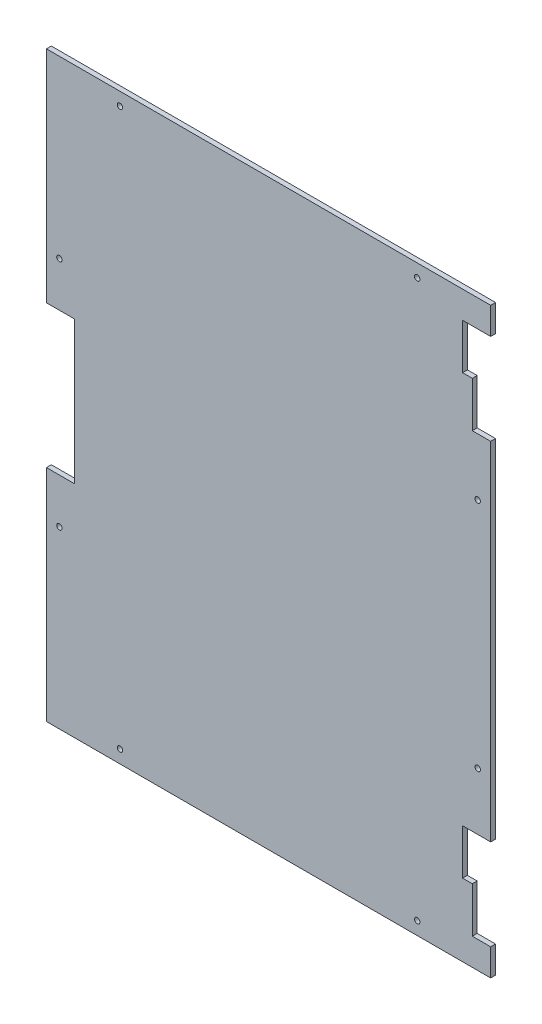
ISO-10303-21;
HEADER;
FILE_DESCRIPTION(('STEP AP214'),'2;1');
FILE_NAME('part.step','',(''),(''),'','','');
FILE_SCHEMA(('AUTOMOTIVE_DESIGN { 1 0 10303 214 1 1 1 1 }'));
ENDSEC;
DATA;
#1=APPLICATION_CONTEXT('core data for automotive mechanical design processes');
#2=APPLICATION_PROTOCOL_DEFINITION('international standard','automotive_design',2000,#1);
#3=PRODUCT_CONTEXT('',#1,'mechanical');
#4=PRODUCT('Part','Part','',(#3));
#5=PRODUCT_RELATED_PRODUCT_CATEGORY('part','',(#4));
#6=PRODUCT_DEFINITION_FORMATION('','',#4);
#7=PRODUCT_DEFINITION_CONTEXT('part definition',#1,'design');
#8=PRODUCT_DEFINITION('design','',#6,#7);
#9=PRODUCT_DEFINITION_SHAPE('','',#8);
#10=(LENGTH_UNIT() NAMED_UNIT(*) SI_UNIT(.MILLI.,.METRE.));
#11=(NAMED_UNIT(*) PLANE_ANGLE_UNIT() SI_UNIT($,.RADIAN.));
#12=(NAMED_UNIT(*) SI_UNIT($,.STERADIAN.) SOLID_ANGLE_UNIT());
#13=UNCERTAINTY_MEASURE_WITH_UNIT(LENGTH_MEASURE(1.E-05),#10,'distance_accuracy_value','');
#14=(GEOMETRIC_REPRESENTATION_CONTEXT(3) GLOBAL_UNCERTAINTY_ASSIGNED_CONTEXT((#13)) GLOBAL_UNIT_ASSIGNED_CONTEXT((#10,
#11,#12)) REPRESENTATION_CONTEXT('',''));
#15=CARTESIAN_POINT('',(0.,0.,0.));
#16=DIRECTION('',(0.,0.,1.));
#17=DIRECTION('',(1.,0.,0.));
#18=AXIS2_PLACEMENT_3D('',#15,#16,#17);
#19=CARTESIAN_POINT('',(0.,0.,4.5));
#20=DIRECTION('',(0.,0.,1.));
#21=DIRECTION('',(1.,0.,0.));
#22=AXIS2_PLACEMENT_3D('',#19,#20,#21);
#23=PLANE('',#22);
#24=CARTESIAN_POINT('',(192.5,107.5,4.5));
#25=DIRECTION('',(0.,0.,1.));
#26=DIRECTION('',(-1.,0.,0.));
#27=AXIS2_PLACEMENT_3D('',#24,#25,#26);
#28=CIRCLE('',#27,2.5);
#29=CARTESIAN_POINT('',(190.,107.5,4.5));
#30=VERTEX_POINT('',#29);
#31=EDGE_CURVE('E661',#30,#30,#28,.T.);
#32=ORIENTED_EDGE('',*,*,#31,.F.);
#33=EDGE_LOOP('',(#32));
#34=FACE_BOUND('',#33,.T.);
#35=CARTESIAN_POINT('',(-194.5,107.5,4.5));
#36=DIRECTION('',(0.,0.,1.));
#37=DIRECTION('',(1.,0.,0.));
#38=AXIS2_PLACEMENT_3D('',#35,#36,#37);
#39=CIRCLE('',#38,2.5);
#40=CARTESIAN_POINT('',(-192.,107.5,4.5));
#41=VERTEX_POINT('',#40);
#42=EDGE_CURVE('E673',#41,#41,#39,.T.);
#43=ORIENTED_EDGE('',*,*,#42,.F.);
#44=EDGE_LOOP('',(#43));
#45=FACE_BOUND('',#44,.T.);
#46=CARTESIAN_POINT('',(-138.5,257.5,4.5));
#47=DIRECTION('',(0.,0.,1.));
#48=DIRECTION('',(1.,0.,0.));
#49=AXIS2_PLACEMENT_3D('',#46,#47,#48);
#50=CIRCLE('',#49,2.5);
#51=CARTESIAN_POINT('',(-136.,257.5,4.5));
#52=VERTEX_POINT('',#51);
#53=EDGE_CURVE('E685',#52,#52,#50,.T.);
#54=ORIENTED_EDGE('',*,*,#53,.F.);
#55=EDGE_LOOP('',(#54));
#56=FACE_BOUND('',#55,.T.);
#57=CARTESIAN_POINT('',(136.5,-257.5,4.5));
#58=DIRECTION('',(0.,0.,1.));
#59=DIRECTION('',(1.,0.,0.));
#60=AXIS2_PLACEMENT_3D('',#57,#58,#59);
#61=CIRCLE('',#60,2.5);
#62=CARTESIAN_POINT('',(139.,-257.5,4.5));
#63=VERTEX_POINT('',#62);
#64=EDGE_CURVE('E208',#63,#63,#61,.T.);
#65=ORIENTED_EDGE('',*,*,#64,.F.);
#66=EDGE_LOOP('',(#65));
#67=FACE_BOUND('',#66,.T.);
#68=DIRECTION('',(0.,-1.,0.));
#69=VECTOR('',#68,1.);
#70=CARTESIAN_POINT('',(-206.5,269.5,4.5));
#71=LINE('',#70,#69);
#72=CARTESIAN_POINT('',(-206.5,269.5,4.5));
#73=VERTEX_POINT('',#72);
#74=CARTESIAN_POINT('',(-206.5,66.,4.5));
#75=VERTEX_POINT('',#74);
#76=EDGE_CURVE('E132',#73,#75,#71,.T.);
#77=ORIENTED_EDGE('',*,*,#76,.T.);
#78=DIRECTION('',(1.,0.,0.));
#79=VECTOR('',#78,1.);
#80=CARTESIAN_POINT('',(-206.5,66.,4.5));
#81=LINE('',#80,#79);
#82=CARTESIAN_POINT('',(-180.5,66.,4.5));
#83=VERTEX_POINT('',#82);
#84=EDGE_CURVE('E353',#75,#83,#81,.T.);
#85=ORIENTED_EDGE('',*,*,#84,.T.);
#86=DIRECTION('',(0.,-1.,0.));
#87=VECTOR('',#86,1.);
#88=CARTESIAN_POINT('',(-180.5,66.,4.5));
#89=LINE('',#88,#87);
#90=CARTESIAN_POINT('',(-180.5,-66.,4.5));
#91=VERTEX_POINT('',#90);
#92=EDGE_CURVE('E297',#83,#91,#89,.T.);
#93=ORIENTED_EDGE('',*,*,#92,.T.);
#94=DIRECTION('',(-1.,0.,0.));
#95=VECTOR('',#94,1.);
#96=CARTESIAN_POINT('',(-206.5,-66.,4.5));
#97=LINE('',#96,#95);
#98=CARTESIAN_POINT('',(-206.5,-66.,4.5));
#99=VERTEX_POINT('',#98);
#100=EDGE_CURVE('E315',#91,#99,#97,.T.);
#101=ORIENTED_EDGE('',*,*,#100,.T.);
#102=DIRECTION('',(0.,-1.,0.));
#103=VECTOR('',#102,1.);
#104=CARTESIAN_POINT('',(-206.5,-66.,4.5));
#105=LINE('',#104,#103);
#106=CARTESIAN_POINT('',(-206.5,-269.5,4.5));
#107=VERTEX_POINT('',#106);
#108=EDGE_CURVE('E312',#99,#107,#105,.T.);
#109=ORIENTED_EDGE('',*,*,#108,.T.);
#110=DIRECTION('',(1.,0.,0.));
#111=VECTOR('',#110,1.);
#112=CARTESIAN_POINT('',(-206.5,-269.5,4.5));
#113=LINE('',#112,#111);
#114=CARTESIAN_POINT('',(204.5,-269.5,4.5));
#115=VERTEX_POINT('',#114);
#116=EDGE_CURVE('E314',#107,#115,#113,.T.);
#117=ORIENTED_EDGE('',*,*,#116,.T.);
#118=DIRECTION('',(0.,1.,0.));
#119=VECTOR('',#118,1.);
#120=CARTESIAN_POINT('',(204.5,-244.5,4.5));
#121=LINE('',#120,#119);
#122=CARTESIAN_POINT('',(204.5,-244.5,4.5));
#123=VERTEX_POINT('',#122);
#124=EDGE_CURVE('E317',#115,#123,#121,.T.);
#125=ORIENTED_EDGE('',*,*,#124,.T.);
#126=DIRECTION('',(-1.,0.,0.));
#127=VECTOR('',#126,1.);
#128=CARTESIAN_POINT('',(187.5,-244.5,4.5));
#129=LINE('',#128,#127);
#130=CARTESIAN_POINT('',(187.5,-244.5,4.5));
#131=VERTEX_POINT('',#130);
#132=EDGE_CURVE('E323',#123,#131,#129,.T.);
#133=ORIENTED_EDGE('',*,*,#132,.T.);
#134=DIRECTION('',(0.,1.,0.));
#135=VECTOR('',#134,1.);
#136=CARTESIAN_POINT('',(187.5,-202.5,4.5));
#137=LINE('',#136,#135);
#138=CARTESIAN_POINT('',(187.5,-202.5,4.5));
#139=VERTEX_POINT('',#138);
#140=EDGE_CURVE('E325',#131,#139,#137,.T.);
#141=ORIENTED_EDGE('',*,*,#140,.T.);
#142=DIRECTION('',(-1.,0.,0.));
#143=VECTOR('',#142,1.);
#144=CARTESIAN_POINT('',(178.5,-202.5,4.5));
#145=LINE('',#144,#143);
#146=CARTESIAN_POINT('',(178.5,-202.5,4.5));
#147=VERTEX_POINT('',#146);
#148=EDGE_CURVE('E327',#139,#147,#145,.T.);
#149=ORIENTED_EDGE('',*,*,#148,.T.);
#150=DIRECTION('',(0.,1.,0.));
#151=VECTOR('',#150,1.);
#152=CARTESIAN_POINT('',(178.5,-160.5,4.5));
#153=LINE('',#152,#151);
#154=CARTESIAN_POINT('',(178.5,-160.5,4.5));
#155=VERTEX_POINT('',#154);
#156=EDGE_CURVE('E329',#147,#155,#153,.T.);
#157=ORIENTED_EDGE('',*,*,#156,.T.);
#158=DIRECTION('',(1.,0.,0.));
#159=VECTOR('',#158,1.);
#160=CARTESIAN_POINT('',(204.5,-160.5,4.5));
#161=LINE('',#160,#159);
#162=CARTESIAN_POINT('',(204.5,-160.5,4.5));
#163=VERTEX_POINT('',#162);
#164=EDGE_CURVE('E331',#155,#163,#161,.T.);
#165=ORIENTED_EDGE('',*,*,#164,.T.);
#166=DIRECTION('',(0.,1.,0.));
#167=VECTOR('',#166,1.);
#168=CARTESIAN_POINT('',(204.5,160.5,4.5));
#169=LINE('',#168,#167);
#170=CARTESIAN_POINT('',(204.5,160.5,4.5));
#171=VERTEX_POINT('',#170);
#172=EDGE_CURVE('E333',#163,#171,#169,.T.);
#173=ORIENTED_EDGE('',*,*,#172,.T.);
#174=DIRECTION('',(-1.,0.,0.));
#175=VECTOR('',#174,1.);
#176=CARTESIAN_POINT('',(204.5,160.5,4.5));
#177=LINE('',#176,#175);
#178=CARTESIAN_POINT('',(187.5,160.5,4.5));
#179=VERTEX_POINT('',#178);
#180=EDGE_CURVE('E335',#171,#179,#177,.T.);
#181=ORIENTED_EDGE('',*,*,#180,.T.);
#182=DIRECTION('',(0.,1.,0.));
#183=VECTOR('',#182,1.);
#184=CARTESIAN_POINT('',(187.5,202.5,4.5));
#185=LINE('',#184,#183);
#186=CARTESIAN_POINT('',(187.5,202.5,4.5));
#187=VERTEX_POINT('',#186);
#188=EDGE_CURVE('E337',#179,#187,#185,.T.);
#189=ORIENTED_EDGE('',*,*,#188,.T.);
#190=DIRECTION('',(-1.,0.,0.));
#191=VECTOR('',#190,1.);
#192=CARTESIAN_POINT('',(178.5,202.5,4.5));
#193=LINE('',#192,#191);
#194=CARTESIAN_POINT('',(178.5,202.5,4.5));
#195=VERTEX_POINT('',#194);
#196=EDGE_CURVE('E339',#187,#195,#193,.T.);
#197=ORIENTED_EDGE('',*,*,#196,.T.);
#198=DIRECTION('',(0.,1.,0.));
#199=VECTOR('',#198,1.);
#200=CARTESIAN_POINT('',(178.5,202.5,4.5));
#201=LINE('',#200,#199);
#202=CARTESIAN_POINT('',(178.5,244.5,4.5));
#203=VERTEX_POINT('',#202);
#204=EDGE_CURVE('E188',#195,#203,#201,.T.);
#205=ORIENTED_EDGE('',*,*,#204,.T.);
#206=DIRECTION('',(1.,0.,0.));
#207=VECTOR('',#206,1.);
#208=CARTESIAN_POINT('',(204.5,244.5,4.5));
#209=LINE('',#208,#207);
#210=CARTESIAN_POINT('',(204.5,244.5,4.5));
#211=VERTEX_POINT('',#210);
#212=EDGE_CURVE('E182',#203,#211,#209,.T.);
#213=ORIENTED_EDGE('',*,*,#212,.T.);
#214=DIRECTION('',(0.,1.,0.));
#215=VECTOR('',#214,1.);
#216=CARTESIAN_POINT('',(204.5,269.5,4.5));
#217=LINE('',#216,#215);
#218=CARTESIAN_POINT('',(204.5,269.5,4.5));
#219=VERTEX_POINT('',#218);
#220=EDGE_CURVE('E186',#211,#219,#217,.T.);
#221=ORIENTED_EDGE('',*,*,#220,.T.);
#222=DIRECTION('',(-1.,0.,0.));
#223=VECTOR('',#222,1.);
#224=CARTESIAN_POINT('',(-206.5,269.5,4.5));
#225=LINE('',#224,#223);
#226=EDGE_CURVE('E54',#219,#73,#225,.T.);
#227=ORIENTED_EDGE('',*,*,#226,.T.);
#228=EDGE_LOOP('',(#77,#85,#93,#101,#109,#117,#125,#133,#141,#149,#157,#165,#173,#181,#189,#197,
#205,#213,#221,#227));
#229=FACE_BOUND('',#228,.T.);
#230=CARTESIAN_POINT('',(-138.5,-257.5,4.5));
#231=DIRECTION('',(0.,0.,1.));
#232=DIRECTION('',(-1.,0.,0.));
#233=AXIS2_PLACEMENT_3D('',#230,#231,#232);
#234=CIRCLE('',#233,2.5);
#235=CARTESIAN_POINT('',(-141.,-257.5,4.5));
#236=VERTEX_POINT('',#235);
#237=EDGE_CURVE('E691',#236,#236,#234,.T.);
#238=ORIENTED_EDGE('',*,*,#237,.F.);
#239=EDGE_LOOP('',(#238));
#240=FACE_BOUND('',#239,.T.);
#241=CARTESIAN_POINT('',(136.5,257.5,4.5));
#242=DIRECTION('',(0.,0.,1.));
#243=DIRECTION('',(-1.,0.,0.));
#244=AXIS2_PLACEMENT_3D('',#241,#242,#243);
#245=CIRCLE('',#244,2.5);
#246=CARTESIAN_POINT('',(134.,257.5,4.5));
#247=VERTEX_POINT('',#246);
#248=EDGE_CURVE('E679',#247,#247,#245,.T.);
#249=ORIENTED_EDGE('',*,*,#248,.F.);
#250=EDGE_LOOP('',(#249));
#251=FACE_BOUND('',#250,.T.);
#252=CARTESIAN_POINT('',(-194.5,-107.5,4.5));
#253=DIRECTION('',(0.,0.,1.));
#254=DIRECTION('',(-1.,0.,0.));
#255=AXIS2_PLACEMENT_3D('',#252,#253,#254);
#256=CIRCLE('',#255,2.49999999999997);
#257=CARTESIAN_POINT('',(-197.,-107.5,4.5));
#258=VERTEX_POINT('',#257);
#259=EDGE_CURVE('E667',#258,#258,#256,.T.);
#260=ORIENTED_EDGE('',*,*,#259,.F.);
#261=EDGE_LOOP('',(#260));
#262=FACE_BOUND('',#261,.T.);
#263=CARTESIAN_POINT('',(192.5,-107.5,4.5));
#264=DIRECTION('',(0.,0.,1.));
#265=DIRECTION('',(1.,0.,0.));
#266=AXIS2_PLACEMENT_3D('',#263,#264,#265);
#267=CIRCLE('',#266,2.49999999999997);
#268=CARTESIAN_POINT('',(195.,-107.5,4.5));
#269=VERTEX_POINT('',#268);
#270=EDGE_CURVE('E652',#269,#269,#267,.T.);
#271=ORIENTED_EDGE('',*,*,#270,.F.);
#272=EDGE_LOOP('',(#271));
#273=FACE_BOUND('',#272,.T.);
#274=ADVANCED_FACE('F37',(#34,#45,#56,#67,#229,#240,#251,#262,#273),#23,.T.);
#275=CARTESIAN_POINT('',(0.,0.,0.));
#276=DIRECTION('',(0.,0.,1.));
#277=DIRECTION('',(1.,0.,0.));
#278=AXIS2_PLACEMENT_3D('',#275,#276,#277);
#279=PLANE('',#278);
#280=DIRECTION('',(0.,-1.,0.));
#281=VECTOR('',#280,1.);
#282=CARTESIAN_POINT('',(-206.5,160.5,0.));
#283=LINE('',#282,#281);
#284=CARTESIAN_POINT('',(-206.5,269.5,0.));
#285=VERTEX_POINT('',#284);
#286=CARTESIAN_POINT('',(-206.5,66.,0.));
#287=VERTEX_POINT('',#286);
#288=EDGE_CURVE('E126',#285,#287,#283,.T.);
#289=ORIENTED_EDGE('',*,*,#288,.F.);
#290=DIRECTION('',(-1.,0.,0.));
#291=VECTOR('',#290,1.);
#292=CARTESIAN_POINT('',(-206.5,269.5,0.));
#293=LINE('',#292,#291);
#294=CARTESIAN_POINT('',(204.5,269.5,0.));
#295=VERTEX_POINT('',#294);
#296=EDGE_CURVE('E243',#295,#285,#293,.T.);
#297=ORIENTED_EDGE('',*,*,#296,.F.);
#298=DIRECTION('',(0.,1.,0.));
#299=VECTOR('',#298,1.);
#300=CARTESIAN_POINT('',(204.5,269.5,0.));
#301=LINE('',#300,#299);
#302=CARTESIAN_POINT('',(204.5,244.5,0.));
#303=VERTEX_POINT('',#302);
#304=EDGE_CURVE('E119',#303,#295,#301,.T.);
#305=ORIENTED_EDGE('',*,*,#304,.F.);
#306=DIRECTION('',(1.,0.,0.));
#307=VECTOR('',#306,1.);
#308=CARTESIAN_POINT('',(204.5,244.5,0.));
#309=LINE('',#308,#307);
#310=CARTESIAN_POINT('',(178.5,244.5,0.));
#311=VERTEX_POINT('',#310);
#312=EDGE_CURVE('E196',#311,#303,#309,.T.);
#313=ORIENTED_EDGE('',*,*,#312,.F.);
#314=DIRECTION('',(0.,1.,0.));
#315=VECTOR('',#314,1.);
#316=CARTESIAN_POINT('',(178.5,202.5,0.));
#317=LINE('',#316,#315);
#318=CARTESIAN_POINT('',(178.5,202.5,0.));
#319=VERTEX_POINT('',#318);
#320=EDGE_CURVE('E239',#319,#311,#317,.T.);
#321=ORIENTED_EDGE('',*,*,#320,.F.);
#322=DIRECTION('',(-1.,0.,0.));
#323=VECTOR('',#322,1.);
#324=CARTESIAN_POINT('',(178.5,202.5,0.));
#325=LINE('',#324,#323);
#326=CARTESIAN_POINT('',(187.5,202.5,0.));
#327=VERTEX_POINT('',#326);
#328=EDGE_CURVE('E237',#327,#319,#325,.T.);
#329=ORIENTED_EDGE('',*,*,#328,.F.);
#330=DIRECTION('',(0.,1.,0.));
#331=VECTOR('',#330,1.);
#332=CARTESIAN_POINT('',(187.5,202.5,0.));
#333=LINE('',#332,#331);
#334=CARTESIAN_POINT('',(187.5,160.5,0.));
#335=VERTEX_POINT('',#334);
#336=EDGE_CURVE('E235',#335,#327,#333,.T.);
#337=ORIENTED_EDGE('',*,*,#336,.F.);
#338=DIRECTION('',(-1.,0.,0.));
#339=VECTOR('',#338,1.);
#340=CARTESIAN_POINT('',(204.5,160.5,0.));
#341=LINE('',#340,#339);
#342=CARTESIAN_POINT('',(204.5,160.5,0.));
#343=VERTEX_POINT('',#342);
#344=EDGE_CURVE('E233',#343,#335,#341,.T.);
#345=ORIENTED_EDGE('',*,*,#344,.F.);
#346=DIRECTION('',(0.,1.,0.));
#347=VECTOR('',#346,1.);
#348=CARTESIAN_POINT('',(204.5,160.5,0.));
#349=LINE('',#348,#347);
#350=CARTESIAN_POINT('',(204.5,-160.5,0.));
#351=VERTEX_POINT('',#350);
#352=EDGE_CURVE('E231',#351,#343,#349,.T.);
#353=ORIENTED_EDGE('',*,*,#352,.F.);
#354=DIRECTION('',(1.,0.,0.));
#355=VECTOR('',#354,1.);
#356=CARTESIAN_POINT('',(204.5,-160.5,0.));
#357=LINE('',#356,#355);
#358=CARTESIAN_POINT('',(178.5,-160.5,0.));
#359=VERTEX_POINT('',#358);
#360=EDGE_CURVE('E229',#359,#351,#357,.T.);
#361=ORIENTED_EDGE('',*,*,#360,.F.);
#362=DIRECTION('',(0.,1.,0.));
#363=VECTOR('',#362,1.);
#364=CARTESIAN_POINT('',(178.5,-160.5,0.));
#365=LINE('',#364,#363);
#366=CARTESIAN_POINT('',(178.5,-202.5,0.));
#367=VERTEX_POINT('',#366);
#368=EDGE_CURVE('E227',#367,#359,#365,.T.);
#369=ORIENTED_EDGE('',*,*,#368,.F.);
#370=DIRECTION('',(-1.,0.,0.));
#371=VECTOR('',#370,1.);
#372=CARTESIAN_POINT('',(178.5,-202.5,0.));
#373=LINE('',#372,#371);
#374=CARTESIAN_POINT('',(187.5,-202.5,0.));
#375=VERTEX_POINT('',#374);
#376=EDGE_CURVE('E225',#375,#367,#373,.T.);
#377=ORIENTED_EDGE('',*,*,#376,.F.);
#378=DIRECTION('',(0.,1.,0.));
#379=VECTOR('',#378,1.);
#380=CARTESIAN_POINT('',(187.5,-202.5,0.));
#381=LINE('',#380,#379);
#382=CARTESIAN_POINT('',(187.5,-244.5,0.));
#383=VERTEX_POINT('',#382);
#384=EDGE_CURVE('E223',#383,#375,#381,.T.);
#385=ORIENTED_EDGE('',*,*,#384,.F.);
#386=DIRECTION('',(-1.,0.,0.));
#387=VECTOR('',#386,1.);
#388=CARTESIAN_POINT('',(187.5,-244.5,0.));
#389=LINE('',#388,#387);
#390=CARTESIAN_POINT('',(204.5,-244.5,0.));
#391=VERTEX_POINT('',#390);
#392=EDGE_CURVE('E221',#391,#383,#389,.T.);
#393=ORIENTED_EDGE('',*,*,#392,.F.);
#394=DIRECTION('',(0.,1.,0.));
#395=VECTOR('',#394,1.);
#396=CARTESIAN_POINT('',(204.5,-244.5,0.));
#397=LINE('',#396,#395);
#398=CARTESIAN_POINT('',(204.5,-269.5,0.));
#399=VERTEX_POINT('',#398);
#400=EDGE_CURVE('E219',#399,#391,#397,.T.);
#401=ORIENTED_EDGE('',*,*,#400,.F.);
#402=DIRECTION('',(1.,0.,0.));
#403=VECTOR('',#402,1.);
#404=CARTESIAN_POINT('',(-206.5,-269.5,0.));
#405=LINE('',#404,#403);
#406=CARTESIAN_POINT('',(-206.5,-269.5,0.));
#407=VERTEX_POINT('',#406);
#408=EDGE_CURVE('E217',#407,#399,#405,.T.);
#409=ORIENTED_EDGE('',*,*,#408,.F.);
#410=DIRECTION('',(0.,-1.,0.));
#411=VECTOR('',#410,1.);
#412=CARTESIAN_POINT('',(-206.5,-244.5,0.));
#413=LINE('',#412,#411);
#414=CARTESIAN_POINT('',(-206.5,-66.,0.));
#415=VERTEX_POINT('',#414);
#416=EDGE_CURVE('E215',#415,#407,#413,.T.);
#417=ORIENTED_EDGE('',*,*,#416,.F.);
#418=DIRECTION('',(-1.,0.,0.));
#419=VECTOR('',#418,1.);
#420=CARTESIAN_POINT('',(-206.5,-66.,0.));
#421=LINE('',#420,#419);
#422=CARTESIAN_POINT('',(-180.5,-66.,0.));
#423=VERTEX_POINT('',#422);
#424=EDGE_CURVE('E212',#423,#415,#421,.T.);
#425=ORIENTED_EDGE('',*,*,#424,.F.);
#426=DIRECTION('',(0.,-1.,0.));
#427=VECTOR('',#426,1.);
#428=CARTESIAN_POINT('',(-180.5,66.,0.));
#429=LINE('',#428,#427);
#430=CARTESIAN_POINT('',(-180.5,66.,0.));
#431=VERTEX_POINT('',#430);
#432=EDGE_CURVE('E210',#431,#423,#429,.T.);
#433=ORIENTED_EDGE('',*,*,#432,.F.);
#434=DIRECTION('',(1.,0.,0.));
#435=VECTOR('',#434,1.);
#436=CARTESIAN_POINT('',(-206.5,66.,0.));
#437=LINE('',#436,#435);
#438=EDGE_CURVE('E207',#287,#431,#437,.T.);
#439=ORIENTED_EDGE('',*,*,#438,.F.);
#440=EDGE_LOOP('',(#289,#297,#305,#313,#321,#329,#337,#345,#353,#361,#369,#377,#385,#393,#401,
#409,#417,#425,#433,#439));
#441=FACE_BOUND('',#440,.T.);
#442=CARTESIAN_POINT('',(136.5,-257.5,0.));
#443=DIRECTION('',(0.,0.,1.));
#444=DIRECTION('',(1.,0.,0.));
#445=AXIS2_PLACEMENT_3D('',#442,#443,#444);
#446=CIRCLE('',#445,2.5);
#447=CARTESIAN_POINT('',(139.,-257.5,0.));
#448=VERTEX_POINT('',#447);
#449=EDGE_CURVE('E357',#448,#448,#446,.T.);
#450=ORIENTED_EDGE('',*,*,#449,.T.);
#451=EDGE_LOOP('',(#450));
#452=FACE_BOUND('',#451,.T.);
#453=CARTESIAN_POINT('',(-138.5,-257.5,0.));
#454=DIRECTION('',(0.,0.,1.));
#455=DIRECTION('',(-1.,0.,0.));
#456=AXIS2_PLACEMENT_3D('',#453,#454,#455);
#457=CIRCLE('',#456,2.5);
#458=CARTESIAN_POINT('',(-141.,-257.5,0.));
#459=VERTEX_POINT('',#458);
#460=EDGE_CURVE('E688',#459,#459,#457,.T.);
#461=ORIENTED_EDGE('',*,*,#460,.T.);
#462=EDGE_LOOP('',(#461));
#463=FACE_BOUND('',#462,.T.);
#464=CARTESIAN_POINT('',(-138.5,257.5,0.));
#465=DIRECTION('',(0.,0.,1.));
#466=DIRECTION('',(1.,0.,0.));
#467=AXIS2_PLACEMENT_3D('',#464,#465,#466);
#468=CIRCLE('',#467,2.5);
#469=CARTESIAN_POINT('',(-136.,257.5,0.));
#470=VERTEX_POINT('',#469);
#471=EDGE_CURVE('E682',#470,#470,#468,.T.);
#472=ORIENTED_EDGE('',*,*,#471,.T.);
#473=EDGE_LOOP('',(#472));
#474=FACE_BOUND('',#473,.T.);
#475=CARTESIAN_POINT('',(136.5,257.5,0.));
#476=DIRECTION('',(0.,0.,1.));
#477=DIRECTION('',(-1.,0.,0.));
#478=AXIS2_PLACEMENT_3D('',#475,#476,#477);
#479=CIRCLE('',#478,2.5);
#480=CARTESIAN_POINT('',(134.,257.5,0.));
#481=VERTEX_POINT('',#480);
#482=EDGE_CURVE('E676',#481,#481,#479,.T.);
#483=ORIENTED_EDGE('',*,*,#482,.T.);
#484=EDGE_LOOP('',(#483));
#485=FACE_BOUND('',#484,.T.);
#486=CARTESIAN_POINT('',(-194.5,107.5,0.));
#487=DIRECTION('',(0.,0.,1.));
#488=DIRECTION('',(1.,0.,0.));
#489=AXIS2_PLACEMENT_3D('',#486,#487,#488);
#490=CIRCLE('',#489,2.5);
#491=CARTESIAN_POINT('',(-192.,107.5,0.));
#492=VERTEX_POINT('',#491);
#493=EDGE_CURVE('E670',#492,#492,#490,.T.);
#494=ORIENTED_EDGE('',*,*,#493,.T.);
#495=EDGE_LOOP('',(#494));
#496=FACE_BOUND('',#495,.T.);
#497=CARTESIAN_POINT('',(-194.5,-107.5,0.));
#498=DIRECTION('',(0.,0.,1.));
#499=DIRECTION('',(-1.,0.,0.));
#500=AXIS2_PLACEMENT_3D('',#497,#498,#499);
#501=CIRCLE('',#500,2.49999999999997);
#502=CARTESIAN_POINT('',(-197.,-107.5,0.));
#503=VERTEX_POINT('',#502);
#504=EDGE_CURVE('E664',#503,#503,#501,.T.);
#505=ORIENTED_EDGE('',*,*,#504,.T.);
#506=EDGE_LOOP('',(#505));
#507=FACE_BOUND('',#506,.T.);
#508=CARTESIAN_POINT('',(192.5,107.5,0.));
#509=DIRECTION('',(0.,0.,1.));
#510=DIRECTION('',(-1.,0.,0.));
#511=AXIS2_PLACEMENT_3D('',#508,#509,#510);
#512=CIRCLE('',#511,2.5);
#513=CARTESIAN_POINT('',(190.,107.5,0.));
#514=VERTEX_POINT('',#513);
#515=EDGE_CURVE('E658',#514,#514,#512,.T.);
#516=ORIENTED_EDGE('',*,*,#515,.T.);
#517=EDGE_LOOP('',(#516));
#518=FACE_BOUND('',#517,.T.);
#519=CARTESIAN_POINT('',(192.5,-107.5,0.));
#520=DIRECTION('',(0.,0.,1.));
#521=DIRECTION('',(1.,0.,0.));
#522=AXIS2_PLACEMENT_3D('',#519,#520,#521);
#523=CIRCLE('',#522,2.49999999999997);
#524=CARTESIAN_POINT('',(195.,-107.5,0.));
#525=VERTEX_POINT('',#524);
#526=EDGE_CURVE('E655',#525,#525,#523,.T.);
#527=ORIENTED_EDGE('',*,*,#526,.T.);
#528=EDGE_LOOP('',(#527));
#529=FACE_BOUND('',#528,.T.);
#530=ADVANCED_FACE('F301',(#441,#452,#463,#474,#485,#496,#507,#518,#529),#279,.F.);
#531=CARTESIAN_POINT('',(-206.5,160.5,4.5));
#532=DIRECTION('',(1.,0.,0.));
#533=DIRECTION('',(0.,1.,0.));
#534=AXIS2_PLACEMENT_3D('',#531,#532,#533);
#535=PLANE('',#534);
#536=ORIENTED_EDGE('',*,*,#288,.T.);
#537=DIRECTION('',(0.,0.,-1.));
#538=VECTOR('',#537,1.);
#539=CARTESIAN_POINT('',(-206.5,66.,4.5));
#540=LINE('',#539,#538);
#541=EDGE_CURVE('E11',#75,#287,#540,.T.);
#542=ORIENTED_EDGE('',*,*,#541,.F.);
#543=ORIENTED_EDGE('',*,*,#76,.F.);
#544=DIRECTION('',(0.,0.,-1.));
#545=VECTOR('',#544,1.);
#546=CARTESIAN_POINT('',(-206.5,269.5,4.5));
#547=LINE('',#546,#545);
#548=EDGE_CURVE('E202',#73,#285,#547,.T.);
#549=ORIENTED_EDGE('',*,*,#548,.T.);
#550=EDGE_LOOP('',(#536,#542,#543,#549));
#551=FACE_BOUND('',#550,.T.);
#552=ADVANCED_FACE('F39',(#551),#535,.F.);
#553=CARTESIAN_POINT('',(-206.5,66.,4.5));
#554=DIRECTION('',(0.,1.,0.));
#555=DIRECTION('',(0.,0.,1.));
#556=AXIS2_PLACEMENT_3D('',#553,#554,#555);
#557=PLANE('',#556);
#558=ORIENTED_EDGE('',*,*,#438,.T.);
#559=DIRECTION('',(0.,0.,-1.));
#560=VECTOR('',#559,1.);
#561=CARTESIAN_POINT('',(-180.5,66.,4.5));
#562=LINE('',#561,#560);
#563=EDGE_CURVE('E46',#83,#431,#562,.T.);
#564=ORIENTED_EDGE('',*,*,#563,.F.);
#565=ORIENTED_EDGE('',*,*,#84,.F.);
#566=ORIENTED_EDGE('',*,*,#541,.T.);
#567=EDGE_LOOP('',(#558,#564,#565,#566));
#568=FACE_BOUND('',#567,.T.);
#569=ADVANCED_FACE('F359',(#568),#557,.F.);
#570=CARTESIAN_POINT('',(-180.5,66.,4.5));
#571=DIRECTION('',(1.,0.,0.));
#572=DIRECTION('',(0.,1.,0.));
#573=AXIS2_PLACEMENT_3D('',#570,#571,#572);
#574=PLANE('',#573);
#575=ORIENTED_EDGE('',*,*,#432,.T.);
#576=DIRECTION('',(0.,0.,-1.));
#577=VECTOR('',#576,1.);
#578=CARTESIAN_POINT('',(-180.5,-66.,4.5));
#579=LINE('',#578,#577);
#580=EDGE_CURVE('E288',#91,#423,#579,.T.);
#581=ORIENTED_EDGE('',*,*,#580,.F.);
#582=ORIENTED_EDGE('',*,*,#92,.F.);
#583=ORIENTED_EDGE('',*,*,#563,.T.);
#584=EDGE_LOOP('',(#575,#581,#582,#583));
#585=FACE_BOUND('',#584,.T.);
#586=ADVANCED_FACE('F295',(#585),#574,.F.);
#587=CARTESIAN_POINT('',(-206.5,-66.,4.5));
#588=DIRECTION('',(0.,-1.,0.));
#589=DIRECTION('',(0.,0.,-1.));
#590=AXIS2_PLACEMENT_3D('',#587,#588,#589);
#591=PLANE('',#590);
#592=ORIENTED_EDGE('',*,*,#424,.T.);
#593=DIRECTION('',(0.,0.,-1.));
#594=VECTOR('',#593,1.);
#595=CARTESIAN_POINT('',(-206.5,-66.,4.5));
#596=LINE('',#595,#594);
#597=EDGE_CURVE('E285',#99,#415,#596,.T.);
#598=ORIENTED_EDGE('',*,*,#597,.F.);
#599=ORIENTED_EDGE('',*,*,#100,.F.);
#600=ORIENTED_EDGE('',*,*,#580,.T.);
#601=EDGE_LOOP('',(#592,#598,#599,#600));
#602=FACE_BOUND('',#601,.T.);
#603=ADVANCED_FACE('F306',(#602),#591,.F.);
#604=CARTESIAN_POINT('',(-206.5,-244.5,4.5));
#605=DIRECTION('',(1.,0.,0.));
#606=DIRECTION('',(0.,1.,0.));
#607=AXIS2_PLACEMENT_3D('',#604,#605,#606);
#608=PLANE('',#607);
#609=ORIENTED_EDGE('',*,*,#416,.T.);
#610=DIRECTION('',(0.,0.,-1.));
#611=VECTOR('',#610,1.);
#612=CARTESIAN_POINT('',(-206.5,-269.5,4.5));
#613=LINE('',#612,#611);
#614=EDGE_CURVE('E282',#107,#407,#613,.T.);
#615=ORIENTED_EDGE('',*,*,#614,.F.);
#616=ORIENTED_EDGE('',*,*,#108,.F.);
#617=ORIENTED_EDGE('',*,*,#597,.T.);
#618=EDGE_LOOP('',(#609,#615,#616,#617));
#619=FACE_BOUND('',#618,.T.);
#620=ADVANCED_FACE('F310',(#619),#608,.F.);
#621=CARTESIAN_POINT('',(-206.5,-269.5,4.5));
#622=DIRECTION('',(0.,1.,0.));
#623=DIRECTION('',(-1.,0.,0.));
#624=AXIS2_PLACEMENT_3D('',#621,#622,#623);
#625=PLANE('',#624);
#626=ORIENTED_EDGE('',*,*,#408,.T.);
#627=DIRECTION('',(0.,0.,-1.));
#628=VECTOR('',#627,1.);
#629=CARTESIAN_POINT('',(204.5,-269.5,4.5));
#630=LINE('',#629,#628);
#631=EDGE_CURVE('E279',#115,#399,#630,.T.);
#632=ORIENTED_EDGE('',*,*,#631,.F.);
#633=ORIENTED_EDGE('',*,*,#116,.F.);
#634=ORIENTED_EDGE('',*,*,#614,.T.);
#635=EDGE_LOOP('',(#626,#632,#633,#634));
#636=FACE_BOUND('',#635,.T.);
#637=ADVANCED_FACE('F424',(#636),#625,.F.);
#638=CARTESIAN_POINT('',(204.5,-244.5,4.5));
#639=DIRECTION('',(-1.,0.,0.));
#640=DIRECTION('',(0.,-1.,0.));
#641=AXIS2_PLACEMENT_3D('',#638,#639,#640);
#642=PLANE('',#641);
#643=ORIENTED_EDGE('',*,*,#400,.T.);
#644=DIRECTION('',(0.,0.,-1.));
#645=VECTOR('',#644,1.);
#646=CARTESIAN_POINT('',(204.5,-244.5,4.5));
#647=LINE('',#646,#645);
#648=EDGE_CURVE('E276',#123,#391,#647,.T.);
#649=ORIENTED_EDGE('',*,*,#648,.F.);
#650=ORIENTED_EDGE('',*,*,#124,.F.);
#651=ORIENTED_EDGE('',*,*,#631,.T.);
#652=EDGE_LOOP('',(#643,#649,#650,#651));
#653=FACE_BOUND('',#652,.T.);
#654=ADVANCED_FACE('F420',(#653),#642,.F.);
#655=CARTESIAN_POINT('',(187.5,-244.5,4.5));
#656=DIRECTION('',(0.,-1.,0.));
#657=DIRECTION('',(0.,0.,-1.));
#658=AXIS2_PLACEMENT_3D('',#655,#656,#657);
#659=PLANE('',#658);
#660=ORIENTED_EDGE('',*,*,#392,.T.);
#661=DIRECTION('',(0.,0.,-1.));
#662=VECTOR('',#661,1.);
#663=CARTESIAN_POINT('',(187.5,-244.5,4.5));
#664=LINE('',#663,#662);
#665=EDGE_CURVE('E273',#131,#383,#664,.T.);
#666=ORIENTED_EDGE('',*,*,#665,.F.);
#667=ORIENTED_EDGE('',*,*,#132,.F.);
#668=ORIENTED_EDGE('',*,*,#648,.T.);
#669=EDGE_LOOP('',(#660,#666,#667,#668));
#670=FACE_BOUND('',#669,.T.);
#671=ADVANCED_FACE('F416',(#670),#659,.F.);
#672=CARTESIAN_POINT('',(187.5,-202.5,4.5));
#673=DIRECTION('',(-1.,0.,0.));
#674=DIRECTION('',(0.,-1.,0.));
#675=AXIS2_PLACEMENT_3D('',#672,#673,#674);
#676=PLANE('',#675);
#677=ORIENTED_EDGE('',*,*,#384,.T.);
#678=DIRECTION('',(0.,0.,-1.));
#679=VECTOR('',#678,1.);
#680=CARTESIAN_POINT('',(187.5,-202.5,4.5));
#681=LINE('',#680,#679);
#682=EDGE_CURVE('E270',#139,#375,#681,.T.);
#683=ORIENTED_EDGE('',*,*,#682,.F.);
#684=ORIENTED_EDGE('',*,*,#140,.F.);
#685=ORIENTED_EDGE('',*,*,#665,.T.);
#686=EDGE_LOOP('',(#677,#683,#684,#685));
#687=FACE_BOUND('',#686,.T.);
#688=ADVANCED_FACE('F412',(#687),#676,.F.);
#689=CARTESIAN_POINT('',(178.5,-202.5,4.5));
#690=DIRECTION('',(0.,-1.,0.));
#691=DIRECTION('',(0.,0.,-1.));
#692=AXIS2_PLACEMENT_3D('',#689,#690,#691);
#693=PLANE('',#692);
#694=ORIENTED_EDGE('',*,*,#376,.T.);
#695=DIRECTION('',(0.,0.,-1.));
#696=VECTOR('',#695,1.);
#697=CARTESIAN_POINT('',(178.5,-202.5,4.5));
#698=LINE('',#697,#696);
#699=EDGE_CURVE('E267',#147,#367,#698,.T.);
#700=ORIENTED_EDGE('',*,*,#699,.F.);
#701=ORIENTED_EDGE('',*,*,#148,.F.);
#702=ORIENTED_EDGE('',*,*,#682,.T.);
#703=EDGE_LOOP('',(#694,#700,#701,#702));
#704=FACE_BOUND('',#703,.T.);
#705=ADVANCED_FACE('F408',(#704),#693,.F.);
#706=CARTESIAN_POINT('',(178.5,-160.5,4.5));
#707=DIRECTION('',(-1.,0.,0.));
#708=DIRECTION('',(0.,0.,1.));
#709=AXIS2_PLACEMENT_3D('',#706,#707,#708);
#710=PLANE('',#709);
#711=ORIENTED_EDGE('',*,*,#368,.T.);
#712=DIRECTION('',(0.,0.,-1.));
#713=VECTOR('',#712,1.);
#714=CARTESIAN_POINT('',(178.5,-160.5,4.5));
#715=LINE('',#714,#713);
#716=EDGE_CURVE('E264',#155,#359,#715,.T.);
#717=ORIENTED_EDGE('',*,*,#716,.F.);
#718=ORIENTED_EDGE('',*,*,#156,.F.);
#719=ORIENTED_EDGE('',*,*,#699,.T.);
#720=EDGE_LOOP('',(#711,#717,#718,#719));
#721=FACE_BOUND('',#720,.T.);
#722=ADVANCED_FACE('F404',(#721),#710,.F.);
#723=CARTESIAN_POINT('',(204.5,-160.5,4.5));
#724=DIRECTION('',(0.,1.,0.));
#725=DIRECTION('',(-1.,0.,0.));
#726=AXIS2_PLACEMENT_3D('',#723,#724,#725);
#727=PLANE('',#726);
#728=ORIENTED_EDGE('',*,*,#360,.T.);
#729=DIRECTION('',(0.,0.,-1.));
#730=VECTOR('',#729,1.);
#731=CARTESIAN_POINT('',(204.5,-160.5,4.5));
#732=LINE('',#731,#730);
#733=EDGE_CURVE('E261',#163,#351,#732,.T.);
#734=ORIENTED_EDGE('',*,*,#733,.F.);
#735=ORIENTED_EDGE('',*,*,#164,.F.);
#736=ORIENTED_EDGE('',*,*,#716,.T.);
#737=EDGE_LOOP('',(#728,#734,#735,#736));
#738=FACE_BOUND('',#737,.T.);
#739=ADVANCED_FACE('F400',(#738),#727,.F.);
#740=CARTESIAN_POINT('',(204.5,160.5,4.5));
#741=DIRECTION('',(-1.,0.,0.));
#742=DIRECTION('',(0.,-1.,0.));
#743=AXIS2_PLACEMENT_3D('',#740,#741,#742);
#744=PLANE('',#743);
#745=ORIENTED_EDGE('',*,*,#352,.T.);
#746=DIRECTION('',(0.,0.,-1.));
#747=VECTOR('',#746,1.);
#748=CARTESIAN_POINT('',(204.5,160.5,4.5));
#749=LINE('',#748,#747);
#750=EDGE_CURVE('E258',#171,#343,#749,.T.);
#751=ORIENTED_EDGE('',*,*,#750,.F.);
#752=ORIENTED_EDGE('',*,*,#172,.F.);
#753=ORIENTED_EDGE('',*,*,#733,.T.);
#754=EDGE_LOOP('',(#745,#751,#752,#753));
#755=FACE_BOUND('',#754,.T.);
#756=ADVANCED_FACE('F396',(#755),#744,.F.);
#757=CARTESIAN_POINT('',(204.5,160.5,4.5));
#758=DIRECTION('',(0.,-1.,0.));
#759=DIRECTION('',(0.,0.,-1.));
#760=AXIS2_PLACEMENT_3D('',#757,#758,#759);
#761=PLANE('',#760);
#762=ORIENTED_EDGE('',*,*,#344,.T.);
#763=DIRECTION('',(0.,0.,-1.));
#764=VECTOR('',#763,1.);
#765=CARTESIAN_POINT('',(187.5,160.5,4.5));
#766=LINE('',#765,#764);
#767=EDGE_CURVE('E255',#179,#335,#766,.T.);
#768=ORIENTED_EDGE('',*,*,#767,.F.);
#769=ORIENTED_EDGE('',*,*,#180,.F.);
#770=ORIENTED_EDGE('',*,*,#750,.T.);
#771=EDGE_LOOP('',(#762,#768,#769,#770));
#772=FACE_BOUND('',#771,.T.);
#773=ADVANCED_FACE('F392',(#772),#761,.F.);
#774=CARTESIAN_POINT('',(187.5,202.5,4.5));
#775=DIRECTION('',(-1.,0.,0.));
#776=DIRECTION('',(0.,-1.,0.));
#777=AXIS2_PLACEMENT_3D('',#774,#775,#776);
#778=PLANE('',#777);
#779=ORIENTED_EDGE('',*,*,#336,.T.);
#780=DIRECTION('',(0.,0.,-1.));
#781=VECTOR('',#780,1.);
#782=CARTESIAN_POINT('',(187.5,202.5,4.5));
#783=LINE('',#782,#781);
#784=EDGE_CURVE('E252',#187,#327,#783,.T.);
#785=ORIENTED_EDGE('',*,*,#784,.F.);
#786=ORIENTED_EDGE('',*,*,#188,.F.);
#787=ORIENTED_EDGE('',*,*,#767,.T.);
#788=EDGE_LOOP('',(#779,#785,#786,#787));
#789=FACE_BOUND('',#788,.T.);
#790=ADVANCED_FACE('F389',(#789),#778,.F.);
#791=CARTESIAN_POINT('',(178.5,202.5,4.5));
#792=DIRECTION('',(0.,-1.,0.));
#793=DIRECTION('',(0.,0.,-1.));
#794=AXIS2_PLACEMENT_3D('',#791,#792,#793);
#795=PLANE('',#794);
#796=ORIENTED_EDGE('',*,*,#328,.T.);
#797=DIRECTION('',(0.,0.,-1.));
#798=VECTOR('',#797,1.);
#799=CARTESIAN_POINT('',(178.5,202.5,4.5));
#800=LINE('',#799,#798);
#801=EDGE_CURVE('E249',#195,#319,#800,.T.);
#802=ORIENTED_EDGE('',*,*,#801,.F.);
#803=ORIENTED_EDGE('',*,*,#196,.F.);
#804=ORIENTED_EDGE('',*,*,#784,.T.);
#805=EDGE_LOOP('',(#796,#802,#803,#804));
#806=FACE_BOUND('',#805,.T.);
#807=ADVANCED_FACE('F345',(#806),#795,.F.);
#808=CARTESIAN_POINT('',(178.5,202.5,4.5));
#809=DIRECTION('',(-1.,0.,0.));
#810=DIRECTION('',(0.,-1.,0.));
#811=AXIS2_PLACEMENT_3D('',#808,#809,#810);
#812=PLANE('',#811);
#813=ORIENTED_EDGE('',*,*,#320,.T.);
#814=DIRECTION('',(0.,0.,-1.));
#815=VECTOR('',#814,1.);
#816=CARTESIAN_POINT('',(178.5,244.5,4.5));
#817=LINE('',#816,#815);
#818=EDGE_CURVE('E197',#203,#311,#817,.T.);
#819=ORIENTED_EDGE('',*,*,#818,.F.);
#820=ORIENTED_EDGE('',*,*,#204,.F.);
#821=ORIENTED_EDGE('',*,*,#801,.T.);
#822=EDGE_LOOP('',(#813,#819,#820,#821));
#823=FACE_BOUND('',#822,.T.);
#824=ADVANCED_FACE('F349',(#823),#812,.F.);
#825=CARTESIAN_POINT('',(204.5,244.5,4.5));
#826=DIRECTION('',(0.,1.,0.));
#827=DIRECTION('',(-1.,0.,0.));
#828=AXIS2_PLACEMENT_3D('',#825,#826,#827);
#829=PLANE('',#828);
#830=ORIENTED_EDGE('',*,*,#312,.T.);
#831=DIRECTION('',(0.,0.,-1.));
#832=VECTOR('',#831,1.);
#833=CARTESIAN_POINT('',(204.5,244.5,4.5));
#834=LINE('',#833,#832);
#835=EDGE_CURVE('E193',#211,#303,#834,.T.);
#836=ORIENTED_EDGE('',*,*,#835,.F.);
#837=ORIENTED_EDGE('',*,*,#212,.F.);
#838=ORIENTED_EDGE('',*,*,#818,.T.);
#839=EDGE_LOOP('',(#830,#836,#837,#838));
#840=FACE_BOUND('',#839,.T.);
#841=ADVANCED_FACE('F194',(#840),#829,.F.);
#842=CARTESIAN_POINT('',(204.5,269.5,4.5));
#843=DIRECTION('',(-1.,0.,0.));
#844=DIRECTION('',(0.,0.,1.));
#845=AXIS2_PLACEMENT_3D('',#842,#843,#844);
#846=PLANE('',#845);
#847=ORIENTED_EDGE('',*,*,#304,.T.);
#848=DIRECTION('',(0.,0.,-1.));
#849=VECTOR('',#848,1.);
#850=CARTESIAN_POINT('',(204.5,269.5,4.5));
#851=LINE('',#850,#849);
#852=EDGE_CURVE('E198',#219,#295,#851,.T.);
#853=ORIENTED_EDGE('',*,*,#852,.F.);
#854=ORIENTED_EDGE('',*,*,#220,.F.);
#855=ORIENTED_EDGE('',*,*,#835,.T.);
#856=EDGE_LOOP('',(#847,#853,#854,#855));
#857=FACE_BOUND('',#856,.T.);
#858=ADVANCED_FACE('F200',(#857),#846,.F.);
#859=CARTESIAN_POINT('',(-206.5,269.5,4.5));
#860=DIRECTION('',(0.,-1.,0.));
#861=DIRECTION('',(1.,0.,0.));
#862=AXIS2_PLACEMENT_3D('',#859,#860,#861);
#863=PLANE('',#862);
#864=ORIENTED_EDGE('',*,*,#296,.T.);
#865=ORIENTED_EDGE('',*,*,#548,.F.);
#866=ORIENTED_EDGE('',*,*,#226,.F.);
#867=ORIENTED_EDGE('',*,*,#852,.T.);
#868=EDGE_LOOP('',(#864,#865,#866,#867));
#869=FACE_BOUND('',#868,.T.);
#870=ADVANCED_FACE('F351',(#869),#863,.F.);
#871=CARTESIAN_POINT('',(136.5,-257.5,4.5));
#872=DIRECTION('',(0.,0.,-1.));
#873=DIRECTION('',(-1.,0.,0.));
#874=AXIS2_PLACEMENT_3D('',#871,#872,#873);
#875=CYLINDRICAL_SURFACE('',#874,2.5);
#876=ORIENTED_EDGE('',*,*,#64,.T.);
#877=EDGE_LOOP('',(#876));
#878=FACE_BOUND('',#877,.T.);
#879=ORIENTED_EDGE('',*,*,#449,.F.);
#880=EDGE_LOOP('',(#879));
#881=FACE_BOUND('',#880,.T.);
#882=ADVANCED_FACE('F376',(#878,#881),#875,.F.);
#883=CARTESIAN_POINT('',(-138.5,-257.5,4.5));
#884=DIRECTION('',(0.,0.,-1.));
#885=DIRECTION('',(-1.,0.,0.));
#886=AXIS2_PLACEMENT_3D('',#883,#884,#885);
#887=CYLINDRICAL_SURFACE('',#886,2.5);
#888=ORIENTED_EDGE('',*,*,#237,.T.);
#889=EDGE_LOOP('',(#888));
#890=FACE_BOUND('',#889,.T.);
#891=ORIENTED_EDGE('',*,*,#460,.F.);
#892=EDGE_LOOP('',(#891));
#893=FACE_BOUND('',#892,.T.);
#894=ADVANCED_FACE('F506',(#890,#893),#887,.F.);
#895=CARTESIAN_POINT('',(-138.5,257.5,4.5));
#896=DIRECTION('',(0.,0.,-1.));
#897=DIRECTION('',(-1.,0.,0.));
#898=AXIS2_PLACEMENT_3D('',#895,#896,#897);
#899=CYLINDRICAL_SURFACE('',#898,2.5);
#900=ORIENTED_EDGE('',*,*,#53,.T.);
#901=EDGE_LOOP('',(#900));
#902=FACE_BOUND('',#901,.T.);
#903=ORIENTED_EDGE('',*,*,#471,.F.);
#904=EDGE_LOOP('',(#903));
#905=FACE_BOUND('',#904,.T.);
#906=ADVANCED_FACE('F513',(#902,#905),#899,.F.);
#907=CARTESIAN_POINT('',(136.5,257.5,4.5));
#908=DIRECTION('',(0.,0.,-1.));
#909=DIRECTION('',(-1.,0.,0.));
#910=AXIS2_PLACEMENT_3D('',#907,#908,#909);
#911=CYLINDRICAL_SURFACE('',#910,2.5);
#912=ORIENTED_EDGE('',*,*,#248,.T.);
#913=EDGE_LOOP('',(#912));
#914=FACE_BOUND('',#913,.T.);
#915=ORIENTED_EDGE('',*,*,#482,.F.);
#916=EDGE_LOOP('',(#915));
#917=FACE_BOUND('',#916,.T.);
#918=ADVANCED_FACE('F520',(#914,#917),#911,.F.);
#919=CARTESIAN_POINT('',(-194.5,107.5,4.5));
#920=DIRECTION('',(0.,0.,-1.));
#921=DIRECTION('',(-1.,0.,0.));
#922=AXIS2_PLACEMENT_3D('',#919,#920,#921);
#923=CYLINDRICAL_SURFACE('',#922,2.5);
#924=ORIENTED_EDGE('',*,*,#42,.T.);
#925=EDGE_LOOP('',(#924));
#926=FACE_BOUND('',#925,.T.);
#927=ORIENTED_EDGE('',*,*,#493,.F.);
#928=EDGE_LOOP('',(#927));
#929=FACE_BOUND('',#928,.T.);
#930=ADVANCED_FACE('F528',(#926,#929),#923,.F.);
#931=CARTESIAN_POINT('',(-194.5,-107.5,4.5));
#932=DIRECTION('',(0.,0.,-1.));
#933=DIRECTION('',(-1.,0.,0.));
#934=AXIS2_PLACEMENT_3D('',#931,#932,#933);
#935=CYLINDRICAL_SURFACE('',#934,2.49999999999997);
#936=ORIENTED_EDGE('',*,*,#259,.T.);
#937=EDGE_LOOP('',(#936));
#938=FACE_BOUND('',#937,.T.);
#939=ORIENTED_EDGE('',*,*,#504,.F.);
#940=EDGE_LOOP('',(#939));
#941=FACE_BOUND('',#940,.T.);
#942=ADVANCED_FACE('F536',(#938,#941),#935,.F.);
#943=CARTESIAN_POINT('',(192.5,107.5,4.5));
#944=DIRECTION('',(0.,0.,-1.));
#945=DIRECTION('',(-1.,0.,0.));
#946=AXIS2_PLACEMENT_3D('',#943,#944,#945);
#947=CYLINDRICAL_SURFACE('',#946,2.5);
#948=ORIENTED_EDGE('',*,*,#31,.T.);
#949=EDGE_LOOP('',(#948));
#950=FACE_BOUND('',#949,.T.);
#951=ORIENTED_EDGE('',*,*,#515,.F.);
#952=EDGE_LOOP('',(#951));
#953=FACE_BOUND('',#952,.T.);
#954=ADVANCED_FACE('F544',(#950,#953),#947,.F.);
#955=CARTESIAN_POINT('',(192.5,-107.5,4.5));
#956=DIRECTION('',(0.,0.,-1.));
#957=DIRECTION('',(-1.,0.,0.));
#958=AXIS2_PLACEMENT_3D('',#955,#956,#957);
#959=CYLINDRICAL_SURFACE('',#958,2.49999999999997);
#960=ORIENTED_EDGE('',*,*,#270,.T.);
#961=EDGE_LOOP('',(#960));
#962=FACE_BOUND('',#961,.T.);
#963=ORIENTED_EDGE('',*,*,#526,.F.);
#964=EDGE_LOOP('',(#963));
#965=FACE_BOUND('',#964,.T.);
#966=ADVANCED_FACE('F552',(#962,#965),#959,.F.);
#967=CLOSED_SHELL('',(#274,#530,#552,#569,#586,#603,#620,#637,#654,#671,#688,#705,#722,#739,
#756,#773,#790,#807,#824,#841,#858,#870,#882,#894,#906,#918,#930,#942,#954,#966));
#968=MANIFOLD_SOLID_BREP('B2',#967);
#969=ADVANCED_BREP_SHAPE_REPRESENTATION('',(#18,#968),#14);
#970=SHAPE_DEFINITION_REPRESENTATION(#9,#969);
ENDSEC;
END-ISO-10303-21;
